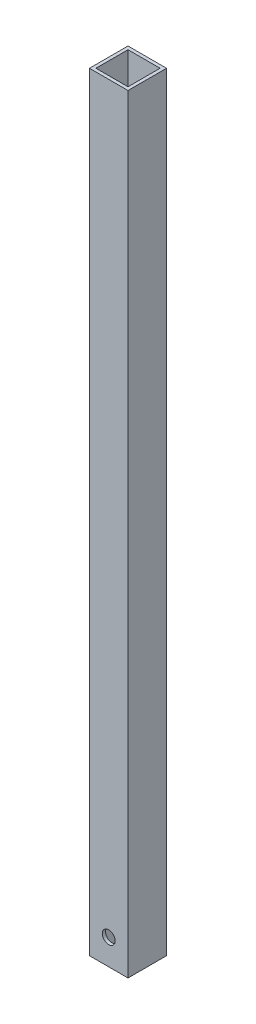
ISO-10303-21;
HEADER;
FILE_DESCRIPTION(('STEP AP214'),'2;1');
FILE_NAME('part.step','',(''),(''),'','','');
FILE_SCHEMA(('AUTOMOTIVE_DESIGN { 1 0 10303 214 1 1 1 1 }'));
ENDSEC;
DATA;
#1=APPLICATION_CONTEXT('core data for automotive mechanical design processes');
#2=APPLICATION_PROTOCOL_DEFINITION('international standard','automotive_design',2000,#1);
#3=PRODUCT_CONTEXT('',#1,'mechanical');
#4=PRODUCT('Part','Part','',(#3));
#5=PRODUCT_RELATED_PRODUCT_CATEGORY('part','',(#4));
#6=PRODUCT_DEFINITION_FORMATION('','',#4);
#7=PRODUCT_DEFINITION_CONTEXT('part definition',#1,'design');
#8=PRODUCT_DEFINITION('design','',#6,#7);
#9=PRODUCT_DEFINITION_SHAPE('','',#8);
#10=(LENGTH_UNIT() NAMED_UNIT(*) SI_UNIT(.MILLI.,.METRE.));
#11=(NAMED_UNIT(*) PLANE_ANGLE_UNIT() SI_UNIT($,.RADIAN.));
#12=(NAMED_UNIT(*) SI_UNIT($,.STERADIAN.) SOLID_ANGLE_UNIT());
#13=UNCERTAINTY_MEASURE_WITH_UNIT(LENGTH_MEASURE(1.E-05),#10,'distance_accuracy_value','');
#14=(GEOMETRIC_REPRESENTATION_CONTEXT(3) GLOBAL_UNCERTAINTY_ASSIGNED_CONTEXT((#13)) GLOBAL_UNIT_ASSIGNED_CONTEXT((#10,
#11,#12)) REPRESENTATION_CONTEXT('',''));
#15=CARTESIAN_POINT('',(0.,0.,0.));
#16=DIRECTION('',(0.,0.,1.));
#17=DIRECTION('',(1.,0.,0.));
#18=AXIS2_PLACEMENT_3D('',#15,#16,#17);
#19=CARTESIAN_POINT('',(0.,380.,0.));
#20=DIRECTION('',(0.,-1.,0.));
#21=DIRECTION('',(0.,0.,-1.));
#22=AXIS2_PLACEMENT_3D('',#19,#20,#21);
#23=PLANE('',#22);
#24=DIRECTION('',(0.,0.,-1.));
#25=VECTOR('',#24,1.);
#26=CARTESIAN_POINT('',(9.525,380.,9.525));
#27=LINE('',#26,#25);
#28=CARTESIAN_POINT('',(9.525,380.,9.525));
#29=VERTEX_POINT('',#28);
#30=CARTESIAN_POINT('',(9.525,380.,-9.525));
#31=VERTEX_POINT('',#30);
#32=EDGE_CURVE('E136',#29,#31,#27,.T.);
#33=ORIENTED_EDGE('',*,*,#32,.T.);
#34=DIRECTION('',(-1.,0.,0.));
#35=VECTOR('',#34,1.);
#36=CARTESIAN_POINT('',(-9.525,380.,-9.525));
#37=LINE('',#36,#35);
#38=CARTESIAN_POINT('',(-9.525,380.,-9.525));
#39=VERTEX_POINT('',#38);
#40=EDGE_CURVE('E139',#31,#39,#37,.T.);
#41=ORIENTED_EDGE('',*,*,#40,.T.);
#42=DIRECTION('',(0.,0.,1.));
#43=VECTOR('',#42,1.);
#44=CARTESIAN_POINT('',(-9.525,380.,9.525));
#45=LINE('',#44,#43);
#46=CARTESIAN_POINT('',(-9.525,380.,9.525));
#47=VERTEX_POINT('',#46);
#48=EDGE_CURVE('E142',#39,#47,#45,.T.);
#49=ORIENTED_EDGE('',*,*,#48,.T.);
#50=DIRECTION('',(1.,0.,0.));
#51=VECTOR('',#50,1.);
#52=CARTESIAN_POINT('',(-9.525,380.,9.525));
#53=LINE('',#52,#51);
#54=EDGE_CURVE('E144',#47,#29,#53,.T.);
#55=ORIENTED_EDGE('',*,*,#54,.T.);
#56=EDGE_LOOP('',(#33,#41,#49,#55));
#57=FACE_BOUND('',#56,.T.);
#58=DIRECTION('',(0.,0.,-1.));
#59=VECTOR('',#58,1.);
#60=CARTESIAN_POINT('',(7.93750000000001,380.,7.93749999999995));
#61=LINE('',#60,#59);
#62=CARTESIAN_POINT('',(7.93750000000001,380.,7.93749999999995));
#63=VERTEX_POINT('',#62);
#64=CARTESIAN_POINT('',(7.9375,380.,-7.93749999999999));
#65=VERTEX_POINT('',#64);
#66=EDGE_CURVE('E98',#63,#65,#61,.T.);
#67=ORIENTED_EDGE('',*,*,#66,.F.);
#68=DIRECTION('',(1.,0.,0.));
#69=VECTOR('',#68,1.);
#70=CARTESIAN_POINT('',(-7.93749999999997,380.,7.93749999999995));
#71=LINE('',#70,#69);
#72=CARTESIAN_POINT('',(-7.93749999999997,380.,7.93749999999995));
#73=VERTEX_POINT('',#72);
#74=EDGE_CURVE('E120',#73,#63,#71,.T.);
#75=ORIENTED_EDGE('',*,*,#74,.F.);
#76=DIRECTION('',(0.,0.,1.));
#77=VECTOR('',#76,1.);
#78=CARTESIAN_POINT('',(-7.93749999999997,380.,7.93749999999995));
#79=LINE('',#78,#77);
#80=CARTESIAN_POINT('',(-7.93749999999997,380.,-7.93749999999999));
#81=VERTEX_POINT('',#80);
#82=EDGE_CURVE('E118',#81,#73,#79,.T.);
#83=ORIENTED_EDGE('',*,*,#82,.F.);
#84=DIRECTION('',(-1.,0.,0.));
#85=VECTOR('',#84,1.);
#86=CARTESIAN_POINT('',(-7.93749999999997,380.,-7.93749999999999));
#87=LINE('',#86,#85);
#88=EDGE_CURVE('E106',#65,#81,#87,.T.);
#89=ORIENTED_EDGE('',*,*,#88,.F.);
#90=EDGE_LOOP('',(#67,#75,#83,#89));
#91=FACE_BOUND('',#90,.T.);
#92=ADVANCED_FACE('F32',(#57,#91),#23,.F.);
#93=CARTESIAN_POINT('',(0.,0.,0.));
#94=DIRECTION('',(0.,-1.,0.));
#95=DIRECTION('',(0.,0.,-1.));
#96=AXIS2_PLACEMENT_3D('',#93,#94,#95);
#97=PLANE('',#96);
#98=DIRECTION('',(0.,0.,-1.));
#99=VECTOR('',#98,1.);
#100=CARTESIAN_POINT('',(9.525,0.,9.525));
#101=LINE('',#100,#99);
#102=CARTESIAN_POINT('',(9.525,0.,9.525));
#103=VERTEX_POINT('',#102);
#104=CARTESIAN_POINT('',(9.525,0.,-9.525));
#105=VERTEX_POINT('',#104);
#106=EDGE_CURVE('E114',#103,#105,#101,.T.);
#107=ORIENTED_EDGE('',*,*,#106,.F.);
#108=DIRECTION('',(1.,0.,0.));
#109=VECTOR('',#108,1.);
#110=CARTESIAN_POINT('',(-9.525,0.,9.525));
#111=LINE('',#110,#109);
#112=CARTESIAN_POINT('',(-9.525,0.,9.525));
#113=VERTEX_POINT('',#112);
#114=EDGE_CURVE('E140',#113,#103,#111,.T.);
#115=ORIENTED_EDGE('',*,*,#114,.F.);
#116=DIRECTION('',(0.,0.,1.));
#117=VECTOR('',#116,1.);
#118=CARTESIAN_POINT('',(-9.525,0.,9.525));
#119=LINE('',#118,#117);
#120=CARTESIAN_POINT('',(-9.525,0.,-9.525));
#121=VERTEX_POINT('',#120);
#122=EDGE_CURVE('E151',#121,#113,#119,.T.);
#123=ORIENTED_EDGE('',*,*,#122,.F.);
#124=DIRECTION('',(-1.,0.,0.));
#125=VECTOR('',#124,1.);
#126=CARTESIAN_POINT('',(-9.525,0.,-9.525));
#127=LINE('',#126,#125);
#128=EDGE_CURVE('E149',#105,#121,#127,.T.);
#129=ORIENTED_EDGE('',*,*,#128,.F.);
#130=EDGE_LOOP('',(#107,#115,#123,#129));
#131=FACE_BOUND('',#130,.T.);
#132=DIRECTION('',(1.,0.,0.));
#133=VECTOR('',#132,1.);
#134=CARTESIAN_POINT('',(-7.93749999999997,0.,7.93749999999995));
#135=LINE('',#134,#133);
#136=CARTESIAN_POINT('',(-7.93749999999997,0.,7.93749999999995));
#137=VERTEX_POINT('',#136);
#138=CARTESIAN_POINT('',(7.93750000000001,0.,7.93749999999995));
#139=VERTEX_POINT('',#138);
#140=EDGE_CURVE('E107',#137,#139,#135,.T.);
#141=ORIENTED_EDGE('',*,*,#140,.T.);
#142=DIRECTION('',(0.,0.,-1.));
#143=VECTOR('',#142,1.);
#144=CARTESIAN_POINT('',(7.93750000000001,0.,7.93749999999995));
#145=LINE('',#144,#143);
#146=CARTESIAN_POINT('',(7.9375,0.,-7.93749999999999));
#147=VERTEX_POINT('',#146);
#148=EDGE_CURVE('E56',#139,#147,#145,.T.);
#149=ORIENTED_EDGE('',*,*,#148,.T.);
#150=DIRECTION('',(-1.,0.,0.));
#151=VECTOR('',#150,1.);
#152=CARTESIAN_POINT('',(-7.93749999999997,0.,-7.93749999999999));
#153=LINE('',#152,#151);
#154=CARTESIAN_POINT('',(-7.93749999999997,0.,-7.93749999999999));
#155=VERTEX_POINT('',#154);
#156=EDGE_CURVE('E113',#147,#155,#153,.T.);
#157=ORIENTED_EDGE('',*,*,#156,.T.);
#158=DIRECTION('',(0.,0.,1.));
#159=VECTOR('',#158,1.);
#160=CARTESIAN_POINT('',(-7.93749999999997,0.,7.93749999999995));
#161=LINE('',#160,#159);
#162=EDGE_CURVE('E128',#155,#137,#161,.T.);
#163=ORIENTED_EDGE('',*,*,#162,.T.);
#164=EDGE_LOOP('',(#141,#149,#157,#163));
#165=FACE_BOUND('',#164,.T.);
#166=ADVANCED_FACE('F170',(#131,#165),#97,.T.);
#167=CARTESIAN_POINT('',(9.525,380.,9.525));
#168=DIRECTION('',(-1.,0.,0.));
#169=DIRECTION('',(0.,0.,1.));
#170=AXIS2_PLACEMENT_3D('',#167,#168,#169);
#171=PLANE('',#170);
#172=ORIENTED_EDGE('',*,*,#106,.T.);
#173=DIRECTION('',(0.,-1.,0.));
#174=VECTOR('',#173,1.);
#175=CARTESIAN_POINT('',(9.525,380.,-9.525));
#176=LINE('',#175,#174);
#177=EDGE_CURVE('E11',#31,#105,#176,.T.);
#178=ORIENTED_EDGE('',*,*,#177,.F.);
#179=ORIENTED_EDGE('',*,*,#32,.F.);
#180=DIRECTION('',(0.,-1.,0.));
#181=VECTOR('',#180,1.);
#182=CARTESIAN_POINT('',(9.525,380.,9.525));
#183=LINE('',#182,#181);
#184=EDGE_CURVE('E146',#29,#103,#183,.T.);
#185=ORIENTED_EDGE('',*,*,#184,.T.);
#186=EDGE_LOOP('',(#172,#178,#179,#185));
#187=FACE_BOUND('',#186,.T.);
#188=ADVANCED_FACE('F34',(#187),#171,.F.);
#189=CARTESIAN_POINT('',(-9.525,380.,-9.525));
#190=DIRECTION('',(0.,0.,1.));
#191=DIRECTION('',(1.,0.,0.));
#192=AXIS2_PLACEMENT_3D('',#189,#190,#191);
#193=PLANE('',#192);
#194=CARTESIAN_POINT('',(0.,12.7,-9.525));
#195=DIRECTION('',(0.,0.,1.));
#196=DIRECTION('',(1.,0.,0.));
#197=AXIS2_PLACEMENT_3D('',#194,#195,#196);
#198=CIRCLE('',#197,3.175);
#199=CARTESIAN_POINT('',(3.175,12.7,-9.525));
#200=VERTEX_POINT('',#199);
#201=EDGE_CURVE('E207',#200,#200,#198,.T.);
#202=ORIENTED_EDGE('',*,*,#201,.T.);
#203=EDGE_LOOP('',(#202));
#204=FACE_BOUND('',#203,.T.);
#205=ORIENTED_EDGE('',*,*,#128,.T.);
#206=DIRECTION('',(0.,-1.,0.));
#207=VECTOR('',#206,1.);
#208=CARTESIAN_POINT('',(-9.525,380.,-9.525));
#209=LINE('',#208,#207);
#210=EDGE_CURVE('E41',#39,#121,#209,.T.);
#211=ORIENTED_EDGE('',*,*,#210,.F.);
#212=ORIENTED_EDGE('',*,*,#40,.F.);
#213=ORIENTED_EDGE('',*,*,#177,.T.);
#214=EDGE_LOOP('',(#205,#211,#212,#213));
#215=FACE_BOUND('',#214,.T.);
#216=ADVANCED_FACE('F180',(#204,#215),#193,.F.);
#217=CARTESIAN_POINT('',(-9.525,380.,9.525));
#218=DIRECTION('',(1.,0.,0.));
#219=DIRECTION('',(0.,0.,-1.));
#220=AXIS2_PLACEMENT_3D('',#217,#218,#219);
#221=PLANE('',#220);
#222=ORIENTED_EDGE('',*,*,#122,.T.);
#223=DIRECTION('',(0.,-1.,0.));
#224=VECTOR('',#223,1.);
#225=CARTESIAN_POINT('',(-9.525,380.,9.525));
#226=LINE('',#225,#224);
#227=EDGE_CURVE('E156',#47,#113,#226,.T.);
#228=ORIENTED_EDGE('',*,*,#227,.F.);
#229=ORIENTED_EDGE('',*,*,#48,.F.);
#230=ORIENTED_EDGE('',*,*,#210,.T.);
#231=EDGE_LOOP('',(#222,#228,#229,#230));
#232=FACE_BOUND('',#231,.T.);
#233=ADVANCED_FACE('F164',(#232),#221,.F.);
#234=CARTESIAN_POINT('',(-9.525,380.,9.525));
#235=DIRECTION('',(0.,0.,-1.));
#236=DIRECTION('',(-1.,0.,0.));
#237=AXIS2_PLACEMENT_3D('',#234,#235,#236);
#238=PLANE('',#237);
#239=CARTESIAN_POINT('',(0.,12.7,9.525));
#240=DIRECTION('',(0.,0.,1.));
#241=DIRECTION('',(1.,0.,0.));
#242=AXIS2_PLACEMENT_3D('',#239,#240,#241);
#243=CIRCLE('',#242,3.175);
#244=CARTESIAN_POINT('',(3.175,12.7,9.525));
#245=VERTEX_POINT('',#244);
#246=EDGE_CURVE('E205',#245,#245,#243,.T.);
#247=ORIENTED_EDGE('',*,*,#246,.F.);
#248=EDGE_LOOP('',(#247));
#249=FACE_BOUND('',#248,.T.);
#250=ORIENTED_EDGE('',*,*,#114,.T.);
#251=ORIENTED_EDGE('',*,*,#184,.F.);
#252=ORIENTED_EDGE('',*,*,#54,.F.);
#253=ORIENTED_EDGE('',*,*,#227,.T.);
#254=EDGE_LOOP('',(#250,#251,#252,#253));
#255=FACE_BOUND('',#254,.T.);
#256=ADVANCED_FACE('F174',(#249,#255),#238,.F.);
#257=CARTESIAN_POINT('',(7.93750000000001,380.,7.93749999999995));
#258=DIRECTION('',(-1.,0.,0.));
#259=DIRECTION('',(0.,0.,1.));
#260=AXIS2_PLACEMENT_3D('',#257,#258,#259);
#261=PLANE('',#260);
#262=ORIENTED_EDGE('',*,*,#148,.F.);
#263=DIRECTION('',(0.,-1.,0.));
#264=VECTOR('',#263,1.);
#265=CARTESIAN_POINT('',(7.93750000000001,380.,7.93749999999995));
#266=LINE('',#265,#264);
#267=EDGE_CURVE('E102',#63,#139,#266,.T.);
#268=ORIENTED_EDGE('',*,*,#267,.F.);
#269=ORIENTED_EDGE('',*,*,#66,.T.);
#270=DIRECTION('',(0.,-1.,0.));
#271=VECTOR('',#270,1.);
#272=CARTESIAN_POINT('',(7.9375,380.,-7.93749999999999));
#273=LINE('',#272,#271);
#274=EDGE_CURVE('E101',#65,#147,#273,.T.);
#275=ORIENTED_EDGE('',*,*,#274,.T.);
#276=EDGE_LOOP('',(#262,#268,#269,#275));
#277=FACE_BOUND('',#276,.T.);
#278=ADVANCED_FACE('F100',(#277),#261,.T.);
#279=CARTESIAN_POINT('',(-7.93749999999997,380.,-7.93749999999999));
#280=DIRECTION('',(0.,0.,1.));
#281=DIRECTION('',(1.,0.,0.));
#282=AXIS2_PLACEMENT_3D('',#279,#280,#281);
#283=PLANE('',#282);
#284=CARTESIAN_POINT('',(0.,12.7,-7.93749999999999));
#285=DIRECTION('',(0.,0.,1.));
#286=DIRECTION('',(1.,0.,0.));
#287=AXIS2_PLACEMENT_3D('',#284,#285,#286);
#288=CIRCLE('',#287,3.175);
#289=CARTESIAN_POINT('',(3.175,12.7,-7.93749999999999));
#290=VERTEX_POINT('',#289);
#291=EDGE_CURVE('E126',#290,#290,#288,.T.);
#292=ORIENTED_EDGE('',*,*,#291,.F.);
#293=EDGE_LOOP('',(#292));
#294=FACE_BOUND('',#293,.T.);
#295=ORIENTED_EDGE('',*,*,#156,.F.);
#296=ORIENTED_EDGE('',*,*,#274,.F.);
#297=ORIENTED_EDGE('',*,*,#88,.T.);
#298=DIRECTION('',(0.,-1.,0.));
#299=VECTOR('',#298,1.);
#300=CARTESIAN_POINT('',(-7.93749999999997,380.,-7.93749999999999));
#301=LINE('',#300,#299);
#302=EDGE_CURVE('E115',#81,#155,#301,.T.);
#303=ORIENTED_EDGE('',*,*,#302,.T.);
#304=EDGE_LOOP('',(#295,#296,#297,#303));
#305=FACE_BOUND('',#304,.T.);
#306=ADVANCED_FACE('F110',(#294,#305),#283,.T.);
#307=CARTESIAN_POINT('',(-7.93749999999997,380.,7.93749999999995));
#308=DIRECTION('',(1.,0.,0.));
#309=DIRECTION('',(0.,0.,-1.));
#310=AXIS2_PLACEMENT_3D('',#307,#308,#309);
#311=PLANE('',#310);
#312=ORIENTED_EDGE('',*,*,#162,.F.);
#313=ORIENTED_EDGE('',*,*,#302,.F.);
#314=ORIENTED_EDGE('',*,*,#82,.T.);
#315=DIRECTION('',(0.,-1.,0.));
#316=VECTOR('',#315,1.);
#317=CARTESIAN_POINT('',(-7.93749999999997,380.,7.93749999999995));
#318=LINE('',#317,#316);
#319=EDGE_CURVE('E48',#73,#137,#318,.T.);
#320=ORIENTED_EDGE('',*,*,#319,.T.);
#321=EDGE_LOOP('',(#312,#313,#314,#320));
#322=FACE_BOUND('',#321,.T.);
#323=ADVANCED_FACE('F220',(#322),#311,.T.);
#324=CARTESIAN_POINT('',(-7.93749999999997,380.,7.93749999999995));
#325=DIRECTION('',(0.,0.,-1.));
#326=DIRECTION('',(-1.,0.,0.));
#327=AXIS2_PLACEMENT_3D('',#324,#325,#326);
#328=PLANE('',#327);
#329=CARTESIAN_POINT('',(0.,12.7,7.93749999999995));
#330=DIRECTION('',(0.,0.,-1.));
#331=DIRECTION('',(-1.,0.,0.));
#332=AXIS2_PLACEMENT_3D('',#329,#330,#331);
#333=CIRCLE('',#332,3.175);
#334=CARTESIAN_POINT('',(-3.175,12.7,7.93749999999995));
#335=VERTEX_POINT('',#334);
#336=EDGE_CURVE('E36',#335,#335,#333,.T.);
#337=ORIENTED_EDGE('',*,*,#336,.F.);
#338=EDGE_LOOP('',(#337));
#339=FACE_BOUND('',#338,.T.);
#340=ORIENTED_EDGE('',*,*,#140,.F.);
#341=ORIENTED_EDGE('',*,*,#319,.F.);
#342=ORIENTED_EDGE('',*,*,#74,.T.);
#343=ORIENTED_EDGE('',*,*,#267,.T.);
#344=EDGE_LOOP('',(#340,#341,#342,#343));
#345=FACE_BOUND('',#344,.T.);
#346=ADVANCED_FACE('F218',(#339,#345),#328,.T.);
#347=CARTESIAN_POINT('',(0.,12.7,-9.525));
#348=DIRECTION('',(0.,0.,1.));
#349=DIRECTION('',(1.,0.,0.));
#350=AXIS2_PLACEMENT_3D('',#347,#348,#349);
#351=CYLINDRICAL_SURFACE('',#350,3.175);
#352=ORIENTED_EDGE('',*,*,#336,.T.);
#353=EDGE_LOOP('',(#352));
#354=FACE_BOUND('',#353,.T.);
#355=ORIENTED_EDGE('',*,*,#246,.T.);
#356=EDGE_LOOP('',(#355));
#357=FACE_BOUND('',#356,.T.);
#358=ADVANCED_FACE('F216',(#354,#357),#351,.F.);
#359=ORIENTED_EDGE('',*,*,#291,.T.);
#360=EDGE_LOOP('',(#359));
#361=FACE_BOUND('',#360,.T.);
#362=ORIENTED_EDGE('',*,*,#201,.F.);
#363=EDGE_LOOP('',(#362));
#364=FACE_BOUND('',#363,.T.);
#365=ADVANCED_FACE('F232',(#361,#364),#351,.F.);
#366=CLOSED_SHELL('',(#92,#166,#188,#216,#233,#256,#278,#306,#323,#346,#358,#365));
#367=MANIFOLD_SOLID_BREP('B2',#366);
#368=ADVANCED_BREP_SHAPE_REPRESENTATION('',(#18,#367),#14);
#369=SHAPE_DEFINITION_REPRESENTATION(#9,#368);
ENDSEC;
END-ISO-10303-21;
